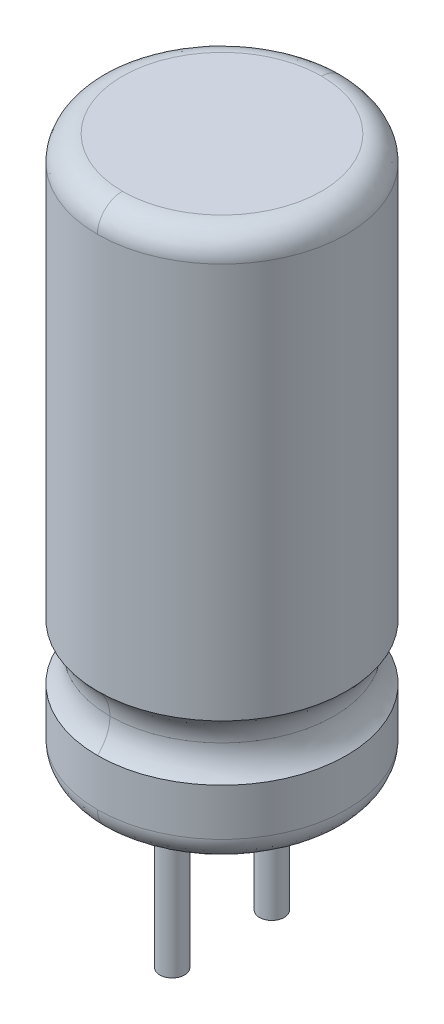
ISO-10303-21;
HEADER;
FILE_DESCRIPTION(('STEP AP214'),'2;1');
FILE_NAME('part.step','',(''),(''),'','','');
FILE_SCHEMA(('AUTOMOTIVE_DESIGN { 1 0 10303 214 1 1 1 1 }'));
ENDSEC;
DATA;
#1=APPLICATION_CONTEXT('core data for automotive mechanical design processes');
#2=APPLICATION_PROTOCOL_DEFINITION('international standard','automotive_design',2000,#1);
#3=PRODUCT_CONTEXT('',#1,'mechanical');
#4=PRODUCT('Part','Part','',(#3));
#5=PRODUCT_RELATED_PRODUCT_CATEGORY('part','',(#4));
#6=PRODUCT_DEFINITION_FORMATION('','',#4);
#7=PRODUCT_DEFINITION_CONTEXT('part definition',#1,'design');
#8=PRODUCT_DEFINITION('design','',#6,#7);
#9=PRODUCT_DEFINITION_SHAPE('','',#8);
#10=(LENGTH_UNIT() NAMED_UNIT(*) SI_UNIT(.MILLI.,.METRE.));
#11=(NAMED_UNIT(*) PLANE_ANGLE_UNIT() SI_UNIT($,.RADIAN.));
#12=(NAMED_UNIT(*) SI_UNIT($,.STERADIAN.) SOLID_ANGLE_UNIT());
#13=UNCERTAINTY_MEASURE_WITH_UNIT(LENGTH_MEASURE(1.E-05),#10,'distance_accuracy_value','');
#14=(GEOMETRIC_REPRESENTATION_CONTEXT(3) GLOBAL_UNCERTAINTY_ASSIGNED_CONTEXT((#13)) GLOBAL_UNIT_ASSIGNED_CONTEXT((#10,
#11,#12)) REPRESENTATION_CONTEXT('',''));
#15=CARTESIAN_POINT('',(0.,0.,0.));
#16=DIRECTION('',(0.,0.,1.));
#17=DIRECTION('',(1.,0.,0.));
#18=AXIS2_PLACEMENT_3D('',#15,#16,#17);
#19=CARTESIAN_POINT('',(-0.253,-3.,1.253));
#20=DIRECTION('',(0.,-1.,0.));
#21=DIRECTION('',(0.,0.,-1.));
#22=AXIS2_PLACEMENT_3D('',#19,#20,#21);
#23=PLANE('',#22);
#24=CARTESIAN_POINT('',(0.,-3.,1.));
#25=DIRECTION('',(0.,1.,0.));
#26=DIRECTION('',(0.,0.,1.));
#27=AXIS2_PLACEMENT_3D('',#24,#25,#26);
#28=CIRCLE('',#27,0.25);
#29=CARTESIAN_POINT('',(0.,-3.,1.25));
#30=VERTEX_POINT('',#29);
#31=EDGE_CURVE('E22',#30,#30,#28,.F.);
#32=ORIENTED_EDGE('',*,*,#31,.T.);
#33=EDGE_LOOP('',(#32));
#34=FACE_BOUND('',#33,.T.);
#35=ADVANCED_FACE('F17',(#34),#23,.T.);
#36=CARTESIAN_POINT('',(-0.253,-3.,-0.747));
#37=DIRECTION('',(0.,-1.,0.));
#38=DIRECTION('',(0.,0.,-1.));
#39=AXIS2_PLACEMENT_3D('',#36,#37,#38);
#40=PLANE('',#39);
#41=CARTESIAN_POINT('',(0.,-3.,-1.));
#42=DIRECTION('',(0.,1.,0.));
#43=DIRECTION('',(0.,0.,1.));
#44=AXIS2_PLACEMENT_3D('',#41,#42,#43);
#45=CIRCLE('',#44,0.25);
#46=CARTESIAN_POINT('',(0.,-3.,-0.75));
#47=VERTEX_POINT('',#46);
#48=EDGE_CURVE('E249',#47,#47,#45,.F.);
#49=ORIENTED_EDGE('',*,*,#48,.T.);
#50=EDGE_LOOP('',(#49));
#51=FACE_BOUND('',#50,.T.);
#52=ADVANCED_FACE('F194',(#51),#40,.T.);
#53=CARTESIAN_POINT('',(0.,2.074875062,2.253746876));
#54=CARTESIAN_POINT('',(-4.507493752,2.074875062,2.253746876));
#55=CARTESIAN_POINT('',(-4.507493752,2.074875062,-2.253746876));
#56=CARTESIAN_POINT('',(0.,2.074875062,-2.253746876));
#57=CARTESIAN_POINT('',(0.,1.803482148,2.226516757));
#58=CARTESIAN_POINT('',(-4.453033514,1.803482148,2.226516757));
#59=CARTESIAN_POINT('',(-4.453033514,1.803482148,-2.226516757));
#60=CARTESIAN_POINT('',(0.,1.803482148,-2.226516757));
#61=CARTESIAN_POINT('',(0.,1.554491531,2.337868746));
#62=CARTESIAN_POINT('',(-4.675737493,1.554491531,2.337868746));
#63=CARTESIAN_POINT('',(-4.675737493,1.554491531,-2.337868746));
#64=CARTESIAN_POINT('',(0.,1.554491531,-2.337868746));
#65=CARTESIAN_POINT('',(0.,1.393859054,2.558306494));
#66=CARTESIAN_POINT('',(-5.116612988,1.393859054,2.558306494));
#67=CARTESIAN_POINT('',(-5.116612988,1.393859054,-2.558306494));
#68=CARTESIAN_POINT('',(0.,1.393859054,-2.558306494));
#69=(BOUNDED_SURFACE() B_SPLINE_SURFACE(3,3,((#53,#54,#55,#56),(#57,#58,#59,#60),(#61,#62,#63,
#64),(#65,#66,#67,#68)),.UNSPECIFIED.,.F.,.F.,.F.) B_SPLINE_SURFACE_WITH_KNOTS((4,4),(4,4),(0.,
1.),(0.,1.),.UNSPECIFIED.) GEOMETRIC_REPRESENTATION_ITEM() RATIONAL_B_SPLINE_SURFACE(((1.,
0.333333333333333,0.333333333333333,1.),(0.911702370142259,0.30390079004742,0.30390079004742,
0.911702370142259),(0.911702370142259,0.30390079004742,0.30390079004742,0.911702370142259),(1.,
0.333333333333333,0.333333333333333,1.))) REPRESENTATION_ITEM('') SURFACE());
#70=CARTESIAN_POINT('',(0.,2.0000000002795,0.));
#71=DIRECTION('',(0.,-1.,0.));
#72=DIRECTION('',(1.,0.,0.));
#73=AXIS2_PLACEMENT_3D('',#70,#71,#72);
#74=CIRCLE('',#73,2.24999999996002);
#75=CARTESIAN_POINT('',(0.,2.,2.24999999996002));
#76=VERTEX_POINT('',#75);
#77=CARTESIAN_POINT('',(0.,2.,-2.24999999996002));
#78=VERTEX_POINT('',#77);
#79=EDGE_CURVE('E323',#76,#78,#74,.T.);
#80=CARTESIAN_POINT('',(0.,2.074875062,-2.253746876));
#81=CARTESIAN_POINT('',(0.,1.803482148,-2.226516757));
#82=CARTESIAN_POINT('',(0.,1.554491531,-2.337868746));
#83=CARTESIAN_POINT('',(0.,1.393859054,-2.558306494));
#84=(BOUNDED_CURVE() B_SPLINE_CURVE(3,(#80,#81,#82,#83),.UNSPECIFIED.,.F.,
.F.) B_SPLINE_CURVE_WITH_KNOTS((4,4),(0.,1.),
.UNSPECIFIED.) CURVE() GEOMETRIC_REPRESENTATION_ITEM() RATIONAL_B_SPLINE_CURVE((1.,
0.911702370142259,0.911702370142259,1.)) REPRESENTATION_ITEM(''));
#85=CARTESIAN_POINT('',(-2.99312094767787E-10,1.44098300579185,-2.50000000009521));
#86=VERTEX_POINT('',#85);
#87=EDGE_CURVE('E74',#86,#78,#84,.F.);
#88=CARTESIAN_POINT('',(0.,1.44098300568778,0.));
#89=DIRECTION('',(0.,-1.,0.));
#90=DIRECTION('',(1.,0.,0.));
#91=AXIS2_PLACEMENT_3D('',#88,#89,#90);
#92=CIRCLE('',#91,2.50000000014282);
#93=CARTESIAN_POINT('',(-1.02551714257666E-09,1.440983006,2.5));
#94=VERTEX_POINT('',#93);
#95=EDGE_CURVE('E368',#94,#86,#92,.T.);
#96=CARTESIAN_POINT('',(0.,2.074875062,2.253746876));
#97=CARTESIAN_POINT('',(0.,1.803482148,2.226516757));
#98=CARTESIAN_POINT('',(0.,1.554491531,2.337868746));
#99=CARTESIAN_POINT('',(0.,1.393859054,2.558306494));
#100=(BOUNDED_CURVE() B_SPLINE_CURVE(3,(#96,#97,#98,#99),.UNSPECIFIED.,.F.,
.F.) B_SPLINE_CURVE_WITH_KNOTS((4,4),(0.,1.),
.UNSPECIFIED.) CURVE() GEOMETRIC_REPRESENTATION_ITEM() RATIONAL_B_SPLINE_CURVE((1.,
0.911702370142259,0.911702370142259,1.)) REPRESENTATION_ITEM(''));
#101=EDGE_CURVE('E101',#76,#94,#100,.T.);
#102=ORIENTED_EDGE('',*,*,#79,.T.);
#103=ORIENTED_EDGE('',*,*,#87,.F.);
#104=ORIENTED_EDGE('',*,*,#95,.F.);
#105=ORIENTED_EDGE('',*,*,#101,.F.);
#106=EDGE_LOOP('',(#102,#103,#104,#105));
#107=FACE_BOUND('',#106,.T.);
#108=ADVANCED_FACE('F184',(#107),#69,.F.);
#109=CARTESIAN_POINT('',(0.,0.549916708,-2.497502083));
#110=CARTESIAN_POINT('',(-4.995004165,0.549916708,-2.497502083));
#111=CARTESIAN_POINT('',(-4.995004165,0.549916708,2.497502083));
#112=CARTESIAN_POINT('',(0.,0.549916708,2.497502083));
#113=CARTESIAN_POINT('',(0.,0.209973117,-2.531610211));
#114=CARTESIAN_POINT('',(-5.063220423,0.209973117,-2.531610211));
#115=CARTESIAN_POINT('',(-5.063220423,0.209973117,2.531610211));
#116=CARTESIAN_POINT('',(0.,0.209973117,2.531610211));
#117=CARTESIAN_POINT('',(0.,-0.031610211,-2.290026883));
#118=CARTESIAN_POINT('',(-4.580053765,-0.031610211,-2.290026883));
#119=CARTESIAN_POINT('',(-4.580053765,-0.031610211,2.290026883));
#120=CARTESIAN_POINT('',(0.,-0.031610211,2.290026883));
#121=CARTESIAN_POINT('',(0.,0.002497917,-1.950083292));
#122=CARTESIAN_POINT('',(-3.900166583,0.002497917,-1.950083292));
#123=CARTESIAN_POINT('',(-3.900166583,0.002497917,1.950083292));
#124=CARTESIAN_POINT('',(0.,0.002497917,1.950083292));
#125=(BOUNDED_SURFACE() B_SPLINE_SURFACE(3,3,((#109,#110,#111,#112),(#113,#114,#115,#116),(#117,
#118,#119,#120),(#121,#122,#123,#124)),.UNSPECIFIED.,.F.,.F.,
.F.) B_SPLINE_SURFACE_WITH_KNOTS((4,4),(4,4),(0.,1.),(0.,1.),
.UNSPECIFIED.) GEOMETRIC_REPRESENTATION_ITEM() RATIONAL_B_SPLINE_SURFACE(((1.,0.333333333333333,
0.333333333333333,1.),(0.755320871117972,0.251773623705991,0.251773623705991,0.755320871117972),
(0.755320871117972,0.251773623705991,0.251773623705991,0.755320871117972),(1.,0.333333333333333,
0.333333333333333,1.))) REPRESENTATION_ITEM('') SURFACE());
#126=CARTESIAN_POINT('',(0.,0.549916708,2.497502083));
#127=CARTESIAN_POINT('',(0.,0.209973117,2.531610211));
#128=CARTESIAN_POINT('',(0.,-0.031610211,2.290026883));
#129=CARTESIAN_POINT('',(0.,0.002497917,1.950083292));
#130=(BOUNDED_CURVE() B_SPLINE_CURVE(3,(#126,#127,#128,#129),.UNSPECIFIED.,.F.,
.F.) B_SPLINE_CURVE_WITH_KNOTS((4,4),(0.,1.),
.UNSPECIFIED.) CURVE() GEOMETRIC_REPRESENTATION_ITEM() RATIONAL_B_SPLINE_CURVE((1.,
0.755320871117972,0.755320871117972,1.)) REPRESENTATION_ITEM(''));
#131=CARTESIAN_POINT('',(0.,-1.59716751400767E-10,2.00000000003678));
#132=VERTEX_POINT('',#131);
#133=CARTESIAN_POINT('',(-2.56379285644164E-10,0.499999999581694,2.5000000001331));
#134=VERTEX_POINT('',#133);
#135=EDGE_CURVE('E94',#132,#134,#130,.F.);
#136=CARTESIAN_POINT('',(0.,0.499999999442258,0.));
#137=DIRECTION('',(0.,-1.,0.));
#138=DIRECTION('',(1.,0.,0.));
#139=AXIS2_PLACEMENT_3D('',#136,#137,#138);
#140=CIRCLE('',#139,2.50000000026619);
#141=CARTESIAN_POINT('',(-1.68363053306862E-10,0.499999999628172,-2.5000000001331));
#142=VERTEX_POINT('',#141);
#143=EDGE_CURVE('E83',#134,#142,#140,.T.);
#144=CARTESIAN_POINT('',(0.,0.549916708,-2.497502083));
#145=CARTESIAN_POINT('',(0.,0.209973117,-2.531610211));
#146=CARTESIAN_POINT('',(0.,-0.031610211,-2.290026883));
#147=CARTESIAN_POINT('',(0.,0.002497917,-1.950083292));
#148=(BOUNDED_CURVE() B_SPLINE_CURVE(3,(#144,#145,#146,#147),.UNSPECIFIED.,.F.,
.F.) B_SPLINE_CURVE_WITH_KNOTS((4,4),(0.,1.),
.UNSPECIFIED.) CURVE() GEOMETRIC_REPRESENTATION_ITEM() RATIONAL_B_SPLINE_CURVE((1.,
0.755320871117972,0.755320871117972,1.)) REPRESENTATION_ITEM(''));
#149=CARTESIAN_POINT('',(0.,-1.59716751334528E-10,-2.00000000003678));
#150=VERTEX_POINT('',#149);
#151=EDGE_CURVE('E92',#142,#150,#148,.T.);
#152=CARTESIAN_POINT('',(0.,-2.6619458534675E-10,-2.00000000080507));
#153=CARTESIAN_POINT('',(-4.00000000062784,-2.66194590145223E-10,-2.00000000080507));
#154=CARTESIAN_POINT('',(-4.00000000062784,-2.66194590145223E-10,2.00000000080507));
#155=CARTESIAN_POINT('',(0.,-2.6619458534675E-10,2.00000000080507));
#156=(BOUNDED_CURVE() B_SPLINE_CURVE(3,(#152,#153,#154,#155),.UNSPECIFIED.,.F.,
.F.) B_SPLINE_CURVE_WITH_KNOTS((4,4),(0.,1.),
.UNSPECIFIED.) CURVE() GEOMETRIC_REPRESENTATION_ITEM() RATIONAL_B_SPLINE_CURVE((0.956578301969994,
0.318859433989998,0.318859433989998,0.956578301969994)) REPRESENTATION_ITEM(''));
#157=EDGE_CURVE('E234',#150,#132,#156,.T.);
#158=ORIENTED_EDGE('',*,*,#135,.T.);
#159=ORIENTED_EDGE('',*,*,#143,.T.);
#160=ORIENTED_EDGE('',*,*,#151,.T.);
#161=ORIENTED_EDGE('',*,*,#157,.T.);
#162=EDGE_LOOP('',(#158,#159,#160,#161));
#163=FACE_BOUND('',#162,.T.);
#164=ADVANCED_FACE('F90',(#163),#125,.T.);
#165=CARTESIAN_POINT('',(0.,-3.,1.));
#166=DIRECTION('',(0.,1.,0.));
#167=DIRECTION('',(0.,0.,1.));
#168=AXIS2_PLACEMENT_3D('',#165,#166,#167);
#169=CYLINDRICAL_SURFACE('',#168,0.25);
#170=ORIENTED_EDGE('',*,*,#31,.F.);
#171=EDGE_LOOP('',(#170));
#172=FACE_BOUND('',#171,.T.);
#173=CARTESIAN_POINT('',(0.,0.,1.));
#174=DIRECTION('',(0.,1.,0.));
#175=DIRECTION('',(0.,0.,1.));
#176=AXIS2_PLACEMENT_3D('',#173,#174,#175);
#177=CIRCLE('',#176,0.25);
#178=CARTESIAN_POINT('',(0.,0.,1.25));
#179=VERTEX_POINT('',#178);
#180=EDGE_CURVE('E247',#179,#179,#177,.F.);
#181=ORIENTED_EDGE('',*,*,#180,.T.);
#182=EDGE_LOOP('',(#181));
#183=FACE_BOUND('',#182,.T.);
#184=ADVANCED_FACE('F175',(#172,#183),#169,.T.);
#185=CARTESIAN_POINT('',(0.,-3.,-1.));
#186=DIRECTION('',(0.,1.,0.));
#187=DIRECTION('',(0.,0.,1.));
#188=AXIS2_PLACEMENT_3D('',#185,#186,#187);
#189=CYLINDRICAL_SURFACE('',#188,0.25);
#190=ORIENTED_EDGE('',*,*,#48,.F.);
#191=EDGE_LOOP('',(#190));
#192=FACE_BOUND('',#191,.T.);
#193=CARTESIAN_POINT('',(0.,0.,-1.));
#194=DIRECTION('',(0.,1.,0.));
#195=DIRECTION('',(0.,0.,1.));
#196=AXIS2_PLACEMENT_3D('',#193,#194,#195);
#197=CIRCLE('',#196,0.25);
#198=CARTESIAN_POINT('',(0.,0.,-0.75));
#199=VERTEX_POINT('',#198);
#200=EDGE_CURVE('E238',#199,#199,#197,.F.);
#201=ORIENTED_EDGE('',*,*,#200,.T.);
#202=EDGE_LOOP('',(#201));
#203=FACE_BOUND('',#202,.T.);
#204=ADVANCED_FACE('F166',(#192,#203),#189,.T.);
#205=CARTESIAN_POINT('',(0.,2.606140946,2.558306494));
#206=CARTESIAN_POINT('',(-5.116612988,2.606140946,2.558306494));
#207=CARTESIAN_POINT('',(-5.116612988,2.606140946,-2.558306494));
#208=CARTESIAN_POINT('',(0.,2.606140946,-2.558306494));
#209=CARTESIAN_POINT('',(0.,2.445508469,2.337868746));
#210=CARTESIAN_POINT('',(-4.675737493,2.445508469,2.337868746));
#211=CARTESIAN_POINT('',(-4.675737493,2.445508469,-2.337868746));
#212=CARTESIAN_POINT('',(0.,2.445508469,-2.337868746));
#213=CARTESIAN_POINT('',(0.,2.196517852,2.226516757));
#214=CARTESIAN_POINT('',(-4.453033514,2.196517852,2.226516757));
#215=CARTESIAN_POINT('',(-4.453033514,2.196517852,-2.226516757));
#216=CARTESIAN_POINT('',(0.,2.196517852,-2.226516757));
#217=CARTESIAN_POINT('',(0.,1.925124938,2.253746876));
#218=CARTESIAN_POINT('',(-4.507493752,1.925124938,2.253746876));
#219=CARTESIAN_POINT('',(-4.507493752,1.925124938,-2.253746876));
#220=CARTESIAN_POINT('',(0.,1.925124938,-2.253746876));
#221=(BOUNDED_SURFACE() B_SPLINE_SURFACE(3,3,((#205,#206,#207,#208),(#209,#210,#211,#212),(#213,
#214,#215,#216),(#217,#218,#219,#220)),.UNSPECIFIED.,.F.,.F.,
.F.) B_SPLINE_SURFACE_WITH_KNOTS((4,4),(4,4),(0.,1.),(0.,1.),
.UNSPECIFIED.) GEOMETRIC_REPRESENTATION_ITEM() RATIONAL_B_SPLINE_SURFACE(((1.,0.333333333333333,
0.333333333333333,1.),(0.911702370142259,0.30390079004742,0.30390079004742,0.911702370142259),
(0.911702370142259,0.30390079004742,0.30390079004742,0.911702370142259),(1.,0.333333333333333,
0.333333333333333,1.))) REPRESENTATION_ITEM('') SURFACE());
#222=CARTESIAN_POINT('',(0.,2.606140946,2.558306494));
#223=CARTESIAN_POINT('',(0.,2.445508469,2.337868746));
#224=CARTESIAN_POINT('',(0.,2.196517852,2.226516757));
#225=CARTESIAN_POINT('',(0.,1.925124938,2.253746876));
#226=(BOUNDED_CURVE() B_SPLINE_CURVE(3,(#222,#223,#224,#225),.UNSPECIFIED.,.F.,
.F.) B_SPLINE_CURVE_WITH_KNOTS((4,4),(0.,1.),
.UNSPECIFIED.) CURVE() GEOMETRIC_REPRESENTATION_ITEM() RATIONAL_B_SPLINE_CURVE((1.,
0.911702370142259,0.911702370142259,1.)) REPRESENTATION_ITEM(''));
#227=CARTESIAN_POINT('',(-3.84568928466246E-10,2.55901699419514,2.50000000008926));
#228=VERTEX_POINT('',#227);
#229=EDGE_CURVE('E252',#228,#76,#226,.T.);
#230=CARTESIAN_POINT('',(0.,2.559016994,0.));
#231=DIRECTION('',(0.,-1.,0.));
#232=DIRECTION('',(0.,0.,-1.));
#233=AXIS2_PLACEMENT_3D('',#230,#231,#232);
#234=CIRCLE('',#233,2.5);
#235=CARTESIAN_POINT('',(-1.12242035535916E-10,2.55901699419514,-2.50000000008926));
#236=VERTEX_POINT('',#235);
#237=EDGE_CURVE('E246',#228,#236,#234,.T.);
#238=CARTESIAN_POINT('',(0.,2.606140946,-2.558306494));
#239=CARTESIAN_POINT('',(0.,2.445508469,-2.337868746));
#240=CARTESIAN_POINT('',(0.,2.196517852,-2.226516757));
#241=CARTESIAN_POINT('',(0.,1.925124938,-2.253746876));
#242=(BOUNDED_CURVE() B_SPLINE_CURVE(3,(#238,#239,#240,#241),.UNSPECIFIED.,.F.,
.F.) B_SPLINE_CURVE_WITH_KNOTS((4,4),(0.,1.),
.UNSPECIFIED.) CURVE() GEOMETRIC_REPRESENTATION_ITEM() RATIONAL_B_SPLINE_CURVE((1.,
0.911702370142259,0.911702370142259,1.)) REPRESENTATION_ITEM(''));
#243=EDGE_CURVE('E36',#78,#236,#242,.F.);
#244=ORIENTED_EDGE('',*,*,#229,.F.);
#245=ORIENTED_EDGE('',*,*,#237,.T.);
#246=ORIENTED_EDGE('',*,*,#243,.F.);
#247=ORIENTED_EDGE('',*,*,#79,.F.);
#248=EDGE_LOOP('',(#244,#245,#246,#247));
#249=FACE_BOUND('',#248,.T.);
#250=ADVANCED_FACE('F151',(#249),#221,.F.);
#251=CARTESIAN_POINT('',(0.,10.997502083,-1.950083292));
#252=CARTESIAN_POINT('',(-3.900166583,10.997502083,-1.950083292));
#253=CARTESIAN_POINT('',(-3.900166583,10.997502083,1.950083292));
#254=CARTESIAN_POINT('',(0.,10.997502083,1.950083292));
#255=CARTESIAN_POINT('',(0.,11.031610211,-2.290026883));
#256=CARTESIAN_POINT('',(-4.580053765,11.031610211,-2.290026883));
#257=CARTESIAN_POINT('',(-4.580053765,11.031610211,2.290026883));
#258=CARTESIAN_POINT('',(0.,11.031610211,2.290026883));
#259=CARTESIAN_POINT('',(0.,10.790026883,-2.531610211));
#260=CARTESIAN_POINT('',(-5.063220423,10.790026883,-2.531610211));
#261=CARTESIAN_POINT('',(-5.063220423,10.790026883,2.531610211));
#262=CARTESIAN_POINT('',(0.,10.790026883,2.531610211));
#263=CARTESIAN_POINT('',(0.,10.450083292,-2.497502083));
#264=CARTESIAN_POINT('',(-4.995004165,10.450083292,-2.497502083));
#265=CARTESIAN_POINT('',(-4.995004165,10.450083292,2.497502083));
#266=CARTESIAN_POINT('',(0.,10.450083292,2.497502083));
#267=(BOUNDED_SURFACE() B_SPLINE_SURFACE(3,3,((#251,#252,#253,#254),(#255,#256,#257,#258),(#259,
#260,#261,#262),(#263,#264,#265,#266)),.UNSPECIFIED.,.F.,.F.,
.F.) B_SPLINE_SURFACE_WITH_KNOTS((4,4),(4,4),(0.,1.),(0.,1.),
.UNSPECIFIED.) GEOMETRIC_REPRESENTATION_ITEM() RATIONAL_B_SPLINE_SURFACE(((1.,0.333333333333333,
0.333333333333333,1.),(0.755320871117972,0.251773623705991,0.251773623705991,0.755320871117972),
(0.755320871117972,0.251773623705991,0.251773623705991,0.755320871117972),(1.,0.333333333333333,
0.333333333333333,1.))) REPRESENTATION_ITEM('') SURFACE());
#268=CARTESIAN_POINT('',(0.,10.997502083,1.950083292));
#269=CARTESIAN_POINT('',(0.,11.031610211,2.290026883));
#270=CARTESIAN_POINT('',(0.,10.790026883,2.531610211));
#271=CARTESIAN_POINT('',(0.,10.450083292,2.497502083));
#272=(BOUNDED_CURVE() B_SPLINE_CURVE(3,(#268,#269,#270,#271),.UNSPECIFIED.,.F.,
.F.) B_SPLINE_CURVE_WITH_KNOTS((4,4),(0.,1.),
.UNSPECIFIED.) CURVE() GEOMETRIC_REPRESENTATION_ITEM() RATIONAL_B_SPLINE_CURVE((1.,
0.755320871117972,0.755320871117972,1.)) REPRESENTATION_ITEM(''));
#273=CARTESIAN_POINT('',(0.,10.5000000003486,2.50000000026619));
#274=VERTEX_POINT('',#273);
#275=CARTESIAN_POINT('',(0.,11.0000000001597,2.00000000003678));
#276=VERTEX_POINT('',#275);
#277=EDGE_CURVE('E136',#274,#276,#272,.F.);
#278=CARTESIAN_POINT('',(0.,11.0000000002662,2.00000000080507));
#279=CARTESIAN_POINT('',(-4.00000000062784,11.0000000002662,2.00000000080507));
#280=CARTESIAN_POINT('',(-4.00000000062784,11.0000000002662,-2.00000000080507));
#281=CARTESIAN_POINT('',(0.,11.0000000002662,-2.00000000080507));
#282=(BOUNDED_CURVE() B_SPLINE_CURVE(3,(#278,#279,#280,#281),.UNSPECIFIED.,.F.,
.F.) B_SPLINE_CURVE_WITH_KNOTS((4,4),(0.,1.),
.UNSPECIFIED.) CURVE() GEOMETRIC_REPRESENTATION_ITEM() RATIONAL_B_SPLINE_CURVE((0.956578301969994,
0.318859433989998,0.318859433989998,0.956578301969994)) REPRESENTATION_ITEM(''));
#283=CARTESIAN_POINT('',(0.,11.0000000001597,-2.00000000003678));
#284=VERTEX_POINT('',#283);
#285=EDGE_CURVE('E130',#284,#276,#282,.F.);
#286=CARTESIAN_POINT('',(0.,10.997502083,-1.950083292));
#287=CARTESIAN_POINT('',(0.,11.031610211,-2.290026883));
#288=CARTESIAN_POINT('',(0.,10.790026883,-2.531610211));
#289=CARTESIAN_POINT('',(0.,10.450083292,-2.497502083));
#290=(BOUNDED_CURVE() B_SPLINE_CURVE(3,(#286,#287,#288,#289),.UNSPECIFIED.,.F.,
.F.) B_SPLINE_CURVE_WITH_KNOTS((4,4),(0.,1.),
.UNSPECIFIED.) CURVE() GEOMETRIC_REPRESENTATION_ITEM() RATIONAL_B_SPLINE_CURVE((1.,
0.755320871117972,0.755320871117972,1.)) REPRESENTATION_ITEM(''));
#291=CARTESIAN_POINT('',(-7.48280236856312E-11,10.5000000001162,-2.50000000008873));
#292=VERTEX_POINT('',#291);
#293=EDGE_CURVE('E330',#284,#292,#290,.T.);
#294=CARTESIAN_POINT('',(0.,10.5,0.));
#295=DIRECTION('',(0.,-1.,0.));
#296=DIRECTION('',(0.,0.,-1.));
#297=AXIS2_PLACEMENT_3D('',#294,#295,#296);
#298=CIRCLE('',#297,2.5);
#299=EDGE_CURVE('E353',#292,#274,#298,.F.);
#300=ORIENTED_EDGE('',*,*,#277,.T.);
#301=ORIENTED_EDGE('',*,*,#285,.F.);
#302=ORIENTED_EDGE('',*,*,#293,.T.);
#303=ORIENTED_EDGE('',*,*,#299,.T.);
#304=EDGE_LOOP('',(#300,#301,#302,#303));
#305=FACE_BOUND('',#304,.T.);
#306=ADVANCED_FACE('F138',(#305),#267,.T.);
#307=CARTESIAN_POINT('',(-2.024,11.,-2.024));
#308=DIRECTION('',(0.,1.,0.));
#309=DIRECTION('',(0.,0.,1.));
#310=AXIS2_PLACEMENT_3D('',#307,#308,#309);
#311=PLANE('',#310);
#312=CARTESIAN_POINT('',(0.,11.0000000002662,-2.00000000080507));
#313=CARTESIAN_POINT('',(4.00000000062784,11.0000000002662,-2.00000000080507));
#314=CARTESIAN_POINT('',(4.00000000062784,11.0000000002662,2.00000000080507));
#315=CARTESIAN_POINT('',(0.,11.0000000002662,2.00000000080507));
#316=(BOUNDED_CURVE() B_SPLINE_CURVE(3,(#312,#313,#314,#315),.UNSPECIFIED.,.F.,
.F.) B_SPLINE_CURVE_WITH_KNOTS((4,4),(0.,1.),
.UNSPECIFIED.) CURVE() GEOMETRIC_REPRESENTATION_ITEM() RATIONAL_B_SPLINE_CURVE((0.956578301969994,
0.318859433989998,0.318859433989998,0.956578301969994)) REPRESENTATION_ITEM(''));
#317=EDGE_CURVE('E319',#284,#276,#316,.T.);
#318=ORIENTED_EDGE('',*,*,#317,.F.);
#319=ORIENTED_EDGE('',*,*,#285,.T.);
#320=EDGE_LOOP('',(#318,#319));
#321=FACE_BOUND('',#320,.T.);
#322=ADVANCED_FACE('F150',(#321),#311,.T.);
#323=CARTESIAN_POINT('',(-2.024,0.,-2.024));
#324=DIRECTION('',(0.,1.,0.));
#325=DIRECTION('',(0.,0.,1.));
#326=AXIS2_PLACEMENT_3D('',#323,#324,#325);
#327=PLANE('',#326);
#328=ORIENTED_EDGE('',*,*,#200,.F.);
#329=EDGE_LOOP('',(#328));
#330=FACE_BOUND('',#329,.T.);
#331=ORIENTED_EDGE('',*,*,#180,.F.);
#332=EDGE_LOOP('',(#331));
#333=FACE_BOUND('',#332,.T.);
#334=CARTESIAN_POINT('',(0.,-2.66194585653568E-10,2.00000000080507));
#335=CARTESIAN_POINT('',(4.00000000062784,-2.66194590041317E-10,2.00000000080507));
#336=CARTESIAN_POINT('',(4.00000000062784,-2.66194590041317E-10,-2.00000000080507));
#337=CARTESIAN_POINT('',(0.,-2.66194585653568E-10,-2.00000000080507));
#338=(BOUNDED_CURVE() B_SPLINE_CURVE(3,(#334,#335,#336,#337),.UNSPECIFIED.,.F.,
.F.) B_SPLINE_CURVE_WITH_KNOTS((4,4),(0.,1.),
.UNSPECIFIED.) CURVE() GEOMETRIC_REPRESENTATION_ITEM() RATIONAL_B_SPLINE_CURVE((0.956578301969995,
0.318859433989998,0.318859433989998,0.956578301969995)) REPRESENTATION_ITEM(''));
#339=EDGE_CURVE('E99',#132,#150,#338,.T.);
#340=ORIENTED_EDGE('',*,*,#339,.F.);
#341=ORIENTED_EDGE('',*,*,#157,.F.);
#342=EDGE_LOOP('',(#340,#341));
#343=FACE_BOUND('',#342,.T.);
#344=ADVANCED_FACE('F19',(#330,#333,#343),#327,.F.);
#345=CARTESIAN_POINT('',(0.,10.997502083,1.950083292));
#346=CARTESIAN_POINT('',(3.900166583,10.997502083,1.950083292));
#347=CARTESIAN_POINT('',(3.900166583,10.997502083,-1.950083292));
#348=CARTESIAN_POINT('',(0.,10.997502083,-1.950083292));
#349=CARTESIAN_POINT('',(0.,11.031610211,2.290026883));
#350=CARTESIAN_POINT('',(4.580053765,11.031610211,2.290026883));
#351=CARTESIAN_POINT('',(4.580053765,11.031610211,-2.290026883));
#352=CARTESIAN_POINT('',(0.,11.031610211,-2.290026883));
#353=CARTESIAN_POINT('',(0.,10.790026883,2.531610211));
#354=CARTESIAN_POINT('',(5.063220423,10.790026883,2.531610211));
#355=CARTESIAN_POINT('',(5.063220423,10.790026883,-2.531610211));
#356=CARTESIAN_POINT('',(0.,10.790026883,-2.531610211));
#357=CARTESIAN_POINT('',(0.,10.450083292,2.497502083));
#358=CARTESIAN_POINT('',(4.995004165,10.450083292,2.497502083));
#359=CARTESIAN_POINT('',(4.995004165,10.450083292,-2.497502083));
#360=CARTESIAN_POINT('',(0.,10.450083292,-2.497502083));
#361=(BOUNDED_SURFACE() B_SPLINE_SURFACE(3,3,((#345,#346,#347,#348),(#349,#350,#351,#352),(#353,
#354,#355,#356),(#357,#358,#359,#360)),.UNSPECIFIED.,.F.,.F.,
.F.) B_SPLINE_SURFACE_WITH_KNOTS((4,4),(4,4),(0.,1.),(0.,1.),
.UNSPECIFIED.) GEOMETRIC_REPRESENTATION_ITEM() RATIONAL_B_SPLINE_SURFACE(((1.,0.333333333333333,
0.333333333333333,1.),(0.755320871117972,0.251773623705991,0.251773623705991,0.755320871117972),
(0.755320871117972,0.251773623705991,0.251773623705991,0.755320871117972),(1.,0.333333333333333,
0.333333333333333,1.))) REPRESENTATION_ITEM('') SURFACE());
#362=CARTESIAN_POINT('',(0.,10.5,0.));
#363=DIRECTION('',(0.,-1.,0.));
#364=DIRECTION('',(0.,0.,-1.));
#365=AXIS2_PLACEMENT_3D('',#362,#363,#364);
#366=CIRCLE('',#365,2.5);
#367=EDGE_CURVE('E87',#274,#292,#366,.F.);
#368=ORIENTED_EDGE('',*,*,#317,.T.);
#369=ORIENTED_EDGE('',*,*,#277,.F.);
#370=ORIENTED_EDGE('',*,*,#367,.T.);
#371=ORIENTED_EDGE('',*,*,#293,.F.);
#372=EDGE_LOOP('',(#368,#369,#370,#371));
#373=FACE_BOUND('',#372,.T.);
#374=ADVANCED_FACE('F152',(#373),#361,.T.);
#375=CARTESIAN_POINT('',(0.,0.549916708,2.497502083));
#376=CARTESIAN_POINT('',(4.995004165,0.549916708,2.497502083));
#377=CARTESIAN_POINT('',(4.995004165,0.549916708,-2.497502083));
#378=CARTESIAN_POINT('',(0.,0.549916708,-2.497502083));
#379=CARTESIAN_POINT('',(0.,0.209973117,2.531610211));
#380=CARTESIAN_POINT('',(5.063220423,0.209973117,2.531610211));
#381=CARTESIAN_POINT('',(5.063220423,0.209973117,-2.531610211));
#382=CARTESIAN_POINT('',(0.,0.209973117,-2.531610211));
#383=CARTESIAN_POINT('',(0.,-0.031610211,2.290026883));
#384=CARTESIAN_POINT('',(4.580053765,-0.031610211,2.290026883));
#385=CARTESIAN_POINT('',(4.580053765,-0.031610211,-2.290026883));
#386=CARTESIAN_POINT('',(0.,-0.031610211,-2.290026883));
#387=CARTESIAN_POINT('',(0.,0.002497917,1.950083292));
#388=CARTESIAN_POINT('',(3.900166583,0.002497917,1.950083292));
#389=CARTESIAN_POINT('',(3.900166583,0.002497917,-1.950083292));
#390=CARTESIAN_POINT('',(0.,0.002497917,-1.950083292));
#391=(BOUNDED_SURFACE() B_SPLINE_SURFACE(3,3,((#375,#376,#377,#378),(#379,#380,#381,#382),(#383,
#384,#385,#386),(#387,#388,#389,#390)),.UNSPECIFIED.,.F.,.F.,
.F.) B_SPLINE_SURFACE_WITH_KNOTS((4,4),(4,4),(0.,1.),(0.,1.),
.UNSPECIFIED.) GEOMETRIC_REPRESENTATION_ITEM() RATIONAL_B_SPLINE_SURFACE(((1.,0.333333333333333,
0.333333333333333,1.),(0.755320871117972,0.251773623705991,0.251773623705991,0.755320871117972),
(0.755320871117972,0.251773623705991,0.251773623705991,0.755320871117972),(1.,0.333333333333333,
0.333333333333333,1.))) REPRESENTATION_ITEM('') SURFACE());
#392=CARTESIAN_POINT('',(0.,0.5,0.));
#393=DIRECTION('',(0.,-1.,0.));
#394=DIRECTION('',(0.,0.,-1.));
#395=AXIS2_PLACEMENT_3D('',#392,#393,#394);
#396=CIRCLE('',#395,2.5);
#397=EDGE_CURVE('E80',#142,#134,#396,.T.);
#398=ORIENTED_EDGE('',*,*,#397,.T.);
#399=ORIENTED_EDGE('',*,*,#135,.F.);
#400=ORIENTED_EDGE('',*,*,#339,.T.);
#401=ORIENTED_EDGE('',*,*,#151,.F.);
#402=EDGE_LOOP('',(#398,#399,#400,#401));
#403=FACE_BOUND('',#402,.T.);
#404=ADVANCED_FACE('F97',(#403),#391,.T.);
#405=CARTESIAN_POINT('',(0.,10.5,0.));
#406=DIRECTION('',(0.,-1.,0.));
#407=DIRECTION('',(0.,0.,-1.));
#408=AXIS2_PLACEMENT_3D('',#405,#406,#407);
#409=CYLINDRICAL_SURFACE('',#408,2.5);
#410=CARTESIAN_POINT('',(0.,2.55901699431222,0.));
#411=DIRECTION('',(0.,1.,0.));
#412=DIRECTION('',(-1.,0.,0.));
#413=AXIS2_PLACEMENT_3D('',#410,#411,#412);
#414=CIRCLE('',#413,2.50000000014282);
#415=EDGE_CURVE('E86',#228,#236,#414,.T.);
#416=ORIENTED_EDGE('',*,*,#415,.T.);
#417=ORIENTED_EDGE('',*,*,#237,.F.);
#418=EDGE_LOOP('',(#416,#417));
#419=FACE_BOUND('',#418,.T.);
#420=ORIENTED_EDGE('',*,*,#367,.F.);
#421=ORIENTED_EDGE('',*,*,#299,.F.);
#422=EDGE_LOOP('',(#420,#421));
#423=FACE_BOUND('',#422,.T.);
#424=ADVANCED_FACE('F294',(#419,#423),#409,.T.);
#425=CARTESIAN_POINT('',(0.,1.440983006,0.));
#426=DIRECTION('',(0.,-1.,0.));
#427=DIRECTION('',(1.,0.,0.));
#428=AXIS2_PLACEMENT_3D('',#425,#426,#427);
#429=CYLINDRICAL_SURFACE('',#428,2.5);
#430=ORIENTED_EDGE('',*,*,#95,.T.);
#431=CARTESIAN_POINT('',(0.,1.44098300568778,0.));
#432=DIRECTION('',(0.,-1.,0.));
#433=DIRECTION('',(1.,0.,0.));
#434=AXIS2_PLACEMENT_3D('',#431,#432,#433);
#435=CIRCLE('',#434,2.50000000014282);
#436=EDGE_CURVE('E28',#86,#94,#435,.T.);
#437=ORIENTED_EDGE('',*,*,#436,.T.);
#438=EDGE_LOOP('',(#430,#437));
#439=FACE_BOUND('',#438,.T.);
#440=ORIENTED_EDGE('',*,*,#397,.F.);
#441=ORIENTED_EDGE('',*,*,#143,.F.);
#442=EDGE_LOOP('',(#440,#441));
#443=FACE_BOUND('',#442,.T.);
#444=ADVANCED_FACE('F82',(#439,#443),#429,.T.);
#445=CARTESIAN_POINT('',(0.,2.606140946,-2.558306494));
#446=CARTESIAN_POINT('',(5.116612988,2.606140946,-2.558306494));
#447=CARTESIAN_POINT('',(5.116612988,2.606140946,2.558306494));
#448=CARTESIAN_POINT('',(0.,2.606140946,2.558306494));
#449=CARTESIAN_POINT('',(0.,2.445508469,-2.337868746));
#450=CARTESIAN_POINT('',(4.675737493,2.445508469,-2.337868746));
#451=CARTESIAN_POINT('',(4.675737493,2.445508469,2.337868746));
#452=CARTESIAN_POINT('',(0.,2.445508469,2.337868746));
#453=CARTESIAN_POINT('',(0.,2.196517852,-2.226516757));
#454=CARTESIAN_POINT('',(4.453033514,2.196517852,-2.226516757));
#455=CARTESIAN_POINT('',(4.453033514,2.196517852,2.226516757));
#456=CARTESIAN_POINT('',(0.,2.196517852,2.226516757));
#457=CARTESIAN_POINT('',(0.,1.925124938,-2.253746876));
#458=CARTESIAN_POINT('',(4.507493752,1.925124938,-2.253746876));
#459=CARTESIAN_POINT('',(4.507493752,1.925124938,2.253746876));
#460=CARTESIAN_POINT('',(0.,1.925124938,2.253746876));
#461=(BOUNDED_SURFACE() B_SPLINE_SURFACE(3,3,((#445,#446,#447,#448),(#449,#450,#451,#452),(#453,
#454,#455,#456),(#457,#458,#459,#460)),.UNSPECIFIED.,.F.,.F.,
.F.) B_SPLINE_SURFACE_WITH_KNOTS((4,4),(4,4),(0.,1.),(0.,1.),
.UNSPECIFIED.) GEOMETRIC_REPRESENTATION_ITEM() RATIONAL_B_SPLINE_SURFACE(((1.,0.333333333333333,
0.333333333333333,1.),(0.911702370142259,0.30390079004742,0.30390079004742,0.911702370142259),
(0.911702370142259,0.30390079004742,0.30390079004742,0.911702370142259),(1.,0.333333333333333,
0.333333333333333,1.))) REPRESENTATION_ITEM('') SURFACE());
#462=CARTESIAN_POINT('',(0.,1.9999999997205,0.));
#463=DIRECTION('',(0.,1.,0.));
#464=DIRECTION('',(-1.,0.,0.));
#465=AXIS2_PLACEMENT_3D('',#462,#463,#464);
#466=CIRCLE('',#465,2.24999999996002);
#467=EDGE_CURVE('E11',#76,#78,#466,.T.);
#468=ORIENTED_EDGE('',*,*,#243,.T.);
#469=ORIENTED_EDGE('',*,*,#415,.F.);
#470=ORIENTED_EDGE('',*,*,#229,.T.);
#471=ORIENTED_EDGE('',*,*,#467,.T.);
#472=EDGE_LOOP('',(#468,#469,#470,#471));
#473=FACE_BOUND('',#472,.T.);
#474=ADVANCED_FACE('F269',(#473),#461,.F.);
#475=CARTESIAN_POINT('',(0.,2.074875062,-2.253746876));
#476=CARTESIAN_POINT('',(4.507493752,2.074875062,-2.253746876));
#477=CARTESIAN_POINT('',(4.507493752,2.074875062,2.253746876));
#478=CARTESIAN_POINT('',(0.,2.074875062,2.253746876));
#479=CARTESIAN_POINT('',(0.,1.803482148,-2.226516757));
#480=CARTESIAN_POINT('',(4.453033514,1.803482148,-2.226516757));
#481=CARTESIAN_POINT('',(4.453033514,1.803482148,2.226516757));
#482=CARTESIAN_POINT('',(0.,1.803482148,2.226516757));
#483=CARTESIAN_POINT('',(0.,1.554491531,-2.337868746));
#484=CARTESIAN_POINT('',(4.675737493,1.554491531,-2.337868746));
#485=CARTESIAN_POINT('',(4.675737493,1.554491531,2.337868746));
#486=CARTESIAN_POINT('',(0.,1.554491531,2.337868746));
#487=CARTESIAN_POINT('',(0.,1.393859054,-2.558306494));
#488=CARTESIAN_POINT('',(5.116612988,1.393859054,-2.558306494));
#489=CARTESIAN_POINT('',(5.116612988,1.393859054,2.558306494));
#490=CARTESIAN_POINT('',(0.,1.393859054,2.558306494));
#491=(BOUNDED_SURFACE() B_SPLINE_SURFACE(3,3,((#475,#476,#477,#478),(#479,#480,#481,#482),(#483,
#484,#485,#486),(#487,#488,#489,#490)),.UNSPECIFIED.,.F.,.F.,
.F.) B_SPLINE_SURFACE_WITH_KNOTS((4,4),(4,4),(0.,1.),(0.,1.),
.UNSPECIFIED.) GEOMETRIC_REPRESENTATION_ITEM() RATIONAL_B_SPLINE_SURFACE(((1.,0.333333333333333,
0.333333333333333,1.),(0.911702370142259,0.30390079004742,0.30390079004742,0.911702370142259),
(0.911702370142259,0.30390079004742,0.30390079004742,0.911702370142259),(1.,0.333333333333333,
0.333333333333333,1.))) REPRESENTATION_ITEM('') SURFACE());
#492=ORIENTED_EDGE('',*,*,#467,.F.);
#493=ORIENTED_EDGE('',*,*,#101,.T.);
#494=ORIENTED_EDGE('',*,*,#436,.F.);
#495=ORIENTED_EDGE('',*,*,#87,.T.);
#496=EDGE_LOOP('',(#492,#493,#494,#495));
#497=FACE_BOUND('',#496,.T.);
#498=ADVANCED_FACE('F267',(#497),#491,.F.);
#499=CLOSED_SHELL('',(#35,#52,#108,#164,#184,#204,#250,#306,#322,#344,#374,#404,#424,#444,#474,#498));
#500=MANIFOLD_SOLID_BREP('B1',#499);
#501=ADVANCED_BREP_SHAPE_REPRESENTATION('',(#18,#500),#14);
#502=SHAPE_DEFINITION_REPRESENTATION(#9,#501);
ENDSEC;
END-ISO-10303-21;
